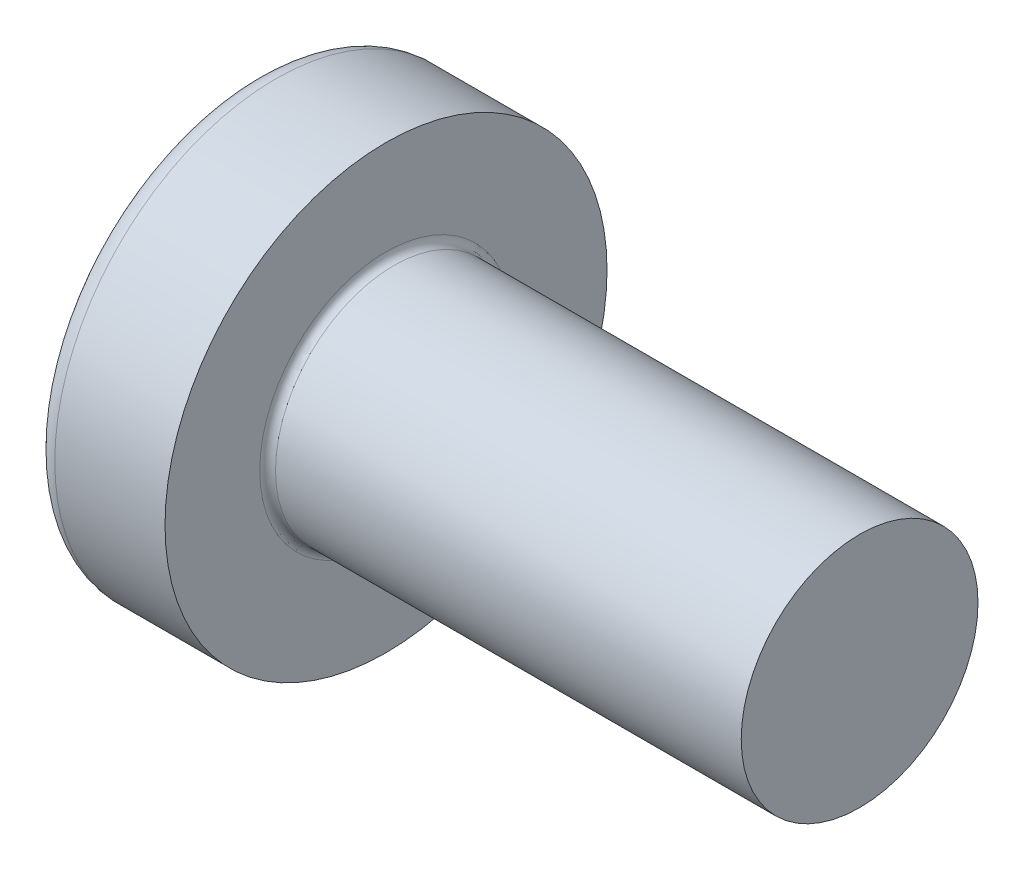
ISO-10303-21;
HEADER;
FILE_DESCRIPTION(('STEP AP214'),'2;1');
FILE_NAME('part.step','',(''),(''),'','','');
FILE_SCHEMA(('AUTOMOTIVE_DESIGN { 1 0 10303 214 1 1 1 1 }'));
ENDSEC;
DATA;
#1=APPLICATION_CONTEXT('core data for automotive mechanical design processes');
#2=APPLICATION_PROTOCOL_DEFINITION('international standard','automotive_design',2000,#1);
#3=PRODUCT_CONTEXT('',#1,'mechanical');
#4=PRODUCT('Part','Part','',(#3));
#5=PRODUCT_RELATED_PRODUCT_CATEGORY('part','',(#4));
#6=PRODUCT_DEFINITION_FORMATION('','',#4);
#7=PRODUCT_DEFINITION_CONTEXT('part definition',#1,'design');
#8=PRODUCT_DEFINITION('design','',#6,#7);
#9=PRODUCT_DEFINITION_SHAPE('','',#8);
#10=(LENGTH_UNIT() NAMED_UNIT(*) SI_UNIT(.MILLI.,.METRE.));
#11=(NAMED_UNIT(*) PLANE_ANGLE_UNIT() SI_UNIT($,.RADIAN.));
#12=(NAMED_UNIT(*) SI_UNIT($,.STERADIAN.) SOLID_ANGLE_UNIT());
#13=UNCERTAINTY_MEASURE_WITH_UNIT(LENGTH_MEASURE(1.E-05),#10,'distance_accuracy_value','');
#14=(GEOMETRIC_REPRESENTATION_CONTEXT(3) GLOBAL_UNCERTAINTY_ASSIGNED_CONTEXT((#13)) GLOBAL_UNIT_ASSIGNED_CONTEXT((#10,
#11,#12)) REPRESENTATION_CONTEXT('',''));
#15=CARTESIAN_POINT('',(0.,0.,0.));
#16=DIRECTION('',(0.,0.,1.));
#17=DIRECTION('',(1.,0.,0.));
#18=AXIS2_PLACEMENT_3D('',#15,#16,#17);
#19=CARTESIAN_POINT('',(5.,0.,0.));
#20=DIRECTION('',(-1.,0.,0.));
#21=DIRECTION('',(0.,1.,0.));
#22=AXIS2_PLACEMENT_3D('',#19,#20,#21);
#23=SPHERICAL_SURFACE('',#22,5.);
#24=CARTESIAN_POINT('',(0.775371598933733,0.,0.));
#25=DIRECTION('',(-1.,0.,0.));
#26=DIRECTION('',(0.,0.,1.));
#27=AXIS2_PLACEMENT_3D('',#24,#25,#26);
#28=CIRCLE('',#27,2.67441860465116);
#29=CARTESIAN_POINT('',(0.775371598933733,0.,2.67441860465116));
#30=VERTEX_POINT('',#29);
#31=EDGE_CURVE('E245',#30,#30,#28,.T.);
#32=ORIENTED_EDGE('',*,*,#31,.T.);
#33=EDGE_LOOP('',(#32));
#34=FACE_BOUND('',#33,.T.);
#35=CARTESIAN_POINT('',(0.0457951200896417,0.,0.));
#36=DIRECTION('',(1.,0.,0.));
#37=DIRECTION('',(0.,0.,-1.));
#38=AXIS2_PLACEMENT_3D('',#35,#36,#37);
#39=CIRCLE('',#38,0.675169614150692);
#40=CARTESIAN_POINT('',(0.0457951200896426,-0.369999999999998,-0.564760133040919));
#41=VERTEX_POINT('',#40);
#42=CARTESIAN_POINT('',(0.0457951200896417,-0.564760133040916,-0.37));
#43=VERTEX_POINT('',#42);
#44=EDGE_CURVE('E381',#41,#43,#39,.F.);
#45=ORIENTED_EDGE('',*,*,#44,.F.);
#46=CARTESIAN_POINT('',(5.,-0.37,0.));
#47=DIRECTION('',(0.,1.,0.));
#48=DIRECTION('',(0.,0.,1.));
#49=AXIS2_PLACEMENT_3D('',#46,#47,#48);
#50=CIRCLE('',#49,4.98629120689917);
#51=CARTESIAN_POINT('',(0.187869734228637,-0.369999999999995,-1.30633162146801));
#52=VERTEX_POINT('',#51);
#53=EDGE_CURVE('E307',#52,#41,#50,.T.);
#54=ORIENTED_EDGE('',*,*,#53,.F.);
#55=CARTESIAN_POINT('',(4.56358262530788,0.,0.875317983306049));
#56=DIRECTION('',(0.446197753347464,0.,-0.894934391398429));
#57=DIRECTION('',(-0.894934391398429,0.,-0.446197753347464));
#58=AXIS2_PLACEMENT_3D('',#55,#56,#57);
#59=CIRCLE('',#58,4.90340272700172);
#60=CARTESIAN_POINT('',(0.187869734228637,0.370000000000005,-1.30633162146801));
#61=VERTEX_POINT('',#60);
#62=EDGE_CURVE('E279',#52,#61,#59,.T.);
#63=ORIENTED_EDGE('',*,*,#62,.T.);
#64=CARTESIAN_POINT('',(5.,0.37,0.));
#65=DIRECTION('',(0.,-1.,0.));
#66=DIRECTION('',(0.,0.,-1.));
#67=AXIS2_PLACEMENT_3D('',#64,#65,#66);
#68=CIRCLE('',#67,4.98629120689917);
#69=CARTESIAN_POINT('',(0.0457951200896421,0.370000000000002,-0.564760133040916));
#70=VERTEX_POINT('',#69);
#71=EDGE_CURVE('E334',#70,#61,#68,.T.);
#72=ORIENTED_EDGE('',*,*,#71,.F.);
#73=CARTESIAN_POINT('',(0.0457951200896417,0.564760133040915,-0.37));
#74=VERTEX_POINT('',#73);
#75=EDGE_CURVE('E400',#74,#70,#39,.F.);
#76=ORIENTED_EDGE('',*,*,#75,.F.);
#77=CARTESIAN_POINT('',(5.,0.,-0.37));
#78=DIRECTION('',(0.,0.,1.));
#79=DIRECTION('',(1.,0.,0.));
#80=AXIS2_PLACEMENT_3D('',#77,#78,#79);
#81=CIRCLE('',#80,4.98629120689917);
#82=CARTESIAN_POINT('',(0.187869734228643,1.30633162146802,-0.37));
#83=VERTEX_POINT('',#82);
#84=EDGE_CURVE('E273',#83,#74,#81,.T.);
#85=ORIENTED_EDGE('',*,*,#84,.F.);
#86=CARTESIAN_POINT('',(4.56358262530808,-0.87531798330579,0.));
#87=DIRECTION('',(0.446197753347408,0.894934391398457,0.));
#88=DIRECTION('',(-0.894934391398457,0.446197753347408,0.));
#89=AXIS2_PLACEMENT_3D('',#86,#87,#88);
#90=CIRCLE('',#89,4.90340272700178);
#91=CARTESIAN_POINT('',(0.187869734228643,1.30633162146802,0.37));
#92=VERTEX_POINT('',#91);
#93=EDGE_CURVE('E276',#83,#92,#90,.T.);
#94=ORIENTED_EDGE('',*,*,#93,.T.);
#95=CARTESIAN_POINT('',(5.,0.,0.37));
#96=DIRECTION('',(0.,0.,-1.));
#97=DIRECTION('',(0.,1.,0.));
#98=AXIS2_PLACEMENT_3D('',#95,#96,#97);
#99=CIRCLE('',#98,4.98629120689917);
#100=CARTESIAN_POINT('',(0.0457951200896417,0.564760133040915,0.37));
#101=VERTEX_POINT('',#100);
#102=EDGE_CURVE('E269',#101,#92,#99,.T.);
#103=ORIENTED_EDGE('',*,*,#102,.F.);
#104=CARTESIAN_POINT('',(0.0457951200896426,0.369999999999998,0.564760133040918));
#105=VERTEX_POINT('',#104);
#106=EDGE_CURVE('E399',#105,#101,#39,.F.);
#107=ORIENTED_EDGE('',*,*,#106,.F.);
#108=CARTESIAN_POINT('',(0.187869734228643,0.369999999999995,1.30633162146802));
#109=VERTEX_POINT('',#108);
#110=EDGE_CURVE('E289',#109,#105,#68,.T.);
#111=ORIENTED_EDGE('',*,*,#110,.F.);
#112=CARTESIAN_POINT('',(4.56358262530808,0.,-0.87531798330579));
#113=DIRECTION('',(0.446197753347408,0.,0.894934391398457));
#114=DIRECTION('',(0.894934391398457,0.,-0.446197753347408));
#115=AXIS2_PLACEMENT_3D('',#112,#113,#114);
#116=CIRCLE('',#115,4.90340272700178);
#117=CARTESIAN_POINT('',(0.187869734228642,-0.370000000000004,1.30633162146802));
#118=VERTEX_POINT('',#117);
#119=EDGE_CURVE('E55',#109,#118,#116,.T.);
#120=ORIENTED_EDGE('',*,*,#119,.T.);
#121=CARTESIAN_POINT('',(0.0457951200896416,-0.370000000000002,0.564760133040916));
#122=VERTEX_POINT('',#121);
#123=EDGE_CURVE('E286',#122,#118,#50,.T.);
#124=ORIENTED_EDGE('',*,*,#123,.F.);
#125=CARTESIAN_POINT('',(0.0457951200896417,-0.564760133040916,0.37));
#126=VERTEX_POINT('',#125);
#127=EDGE_CURVE('E439',#126,#122,#39,.F.);
#128=ORIENTED_EDGE('',*,*,#127,.F.);
#129=CARTESIAN_POINT('',(0.187869734228637,-1.30633162146801,0.37));
#130=VERTEX_POINT('',#129);
#131=EDGE_CURVE('E270',#130,#126,#99,.T.);
#132=ORIENTED_EDGE('',*,*,#131,.F.);
#133=CARTESIAN_POINT('',(4.56358262530788,0.875317983306049,0.));
#134=DIRECTION('',(0.446197753347464,-0.894934391398429,0.));
#135=DIRECTION('',(0.894934391398429,0.446197753347464,0.));
#136=AXIS2_PLACEMENT_3D('',#133,#134,#135);
#137=CIRCLE('',#136,4.90340272700172);
#138=CARTESIAN_POINT('',(0.187869734228637,-1.30633162146801,-0.37));
#139=VERTEX_POINT('',#138);
#140=EDGE_CURVE('E266',#130,#139,#137,.T.);
#141=ORIENTED_EDGE('',*,*,#140,.T.);
#142=EDGE_CURVE('E70',#43,#139,#81,.T.);
#143=ORIENTED_EDGE('',*,*,#142,.F.);
#144=EDGE_LOOP('',(#45,#54,#63,#72,#76,#85,#94,#103,#107,#111,#120,#124,#128,#132,#141,#143));
#145=FACE_BOUND('',#144,.T.);
#146=ADVANCED_FACE('F41',(#34,#145),#23,.T.);
#147=CARTESIAN_POINT('',(1.75,0.527482331819,-0.37));
#148=DIRECTION('',(0.,0.,1.));
#149=DIRECTION('',(1.,0.,0.));
#150=AXIS2_PLACEMENT_3D('',#147,#148,#149);
#151=PLANE('',#150);
#152=ORIENTED_EDGE('',*,*,#84,.T.);
#153=CARTESIAN_POINT('',(-0.987293237053716,0.649401255967161,-0.37));
#154=CARTESIAN_POINT('',(-0.781914975317084,0.632865887002871,-0.37));
#155=CARTESIAN_POINT('',(-0.576547882393372,0.616188977635081,-0.37));
#156=CARTESIAN_POINT('',(-0.165841599226327,0.582441031964227,-0.37));
#157=CARTESIAN_POINT('',(0.0394975903090453,0.56536998705488,-0.37));
#158=CARTESIAN_POINT('',(0.450133475422572,0.530723441326535,-0.37));
#159=CARTESIAN_POINT('',(0.655430171010574,0.513147940624557,-0.37));
#160=CARTESIAN_POINT('',(1.06596140177934,0.477314957985794,-0.37));
#161=CARTESIAN_POINT('',(1.2711959378071,0.459057485806066,-0.37));
#162=CARTESIAN_POINT('',(1.61065292365626,0.428051938688768,-0.37));
#163=CARTESIAN_POINT('',(1.74490059995642,0.415580824990931,-0.37));
#164=CARTESIAN_POINT('',(2.01334321762763,0.39009202340498,-0.37));
#165=CARTESIAN_POINT('',(2.14753815934577,0.377074339177353,-0.37));
#166=CARTESIAN_POINT('',(2.41586354151957,0.350315629452842,-0.37));
#167=CARTESIAN_POINT('',(2.5499939784531,0.33657456817765,-0.37));
#168=CARTESIAN_POINT('',(2.81814173295471,0.308004077741875,-0.37));
#169=CARTESIAN_POINT('',(2.95215904765134,0.293174621747065,-0.37));
#170=CARTESIAN_POINT('',(3.0860955068368,0.277618485071816,-0.37));
#171=B_SPLINE_CURVE_WITH_KNOTS('',3,(#153,#154,#155,#156,#157,#158,#159,#160,#161,#162,#163,
#164,#165,#166,#167,#168,#169,#170),.UNSPECIFIED.,.F.,.F.,(4,2,2,2,2,2,2,2,4),(0.,
0.618128793984691,1.23627109812525,1.85441325887562,2.4725465791681,2.87702276218609,
3.28149623678161,3.68598973550942,4.09049321032311),.UNSPECIFIED.);
#172=CARTESIAN_POINT('',(1.75,0.415013252800437,-0.37));
#173=VERTEX_POINT('',#172);
#174=EDGE_CURVE('E423',#74,#173,#171,.T.);
#175=ORIENTED_EDGE('',*,*,#174,.T.);
#176=DIRECTION('',(0.,1.,0.));
#177=VECTOR('',#176,1.);
#178=CARTESIAN_POINT('',(1.75,-0.527482331818862,-0.37));
#179=LINE('',#178,#177);
#180=CARTESIAN_POINT('',(1.75,0.527482331819,-0.37));
#181=VERTEX_POINT('',#180);
#182=EDGE_CURVE('E363',#173,#181,#179,.T.);
#183=ORIENTED_EDGE('',*,*,#182,.T.);
#184=DIRECTION('',(0.894934391398457,-0.446197753347408,0.));
#185=VECTOR('',#184,1.);
#186=CARTESIAN_POINT('',(0.,1.4,-0.37));
#187=LINE('',#186,#185);
#188=EDGE_CURVE('E246',#83,#181,#187,.T.);
#189=ORIENTED_EDGE('',*,*,#188,.F.);
#190=EDGE_LOOP('',(#152,#175,#183,#189));
#191=FACE_BOUND('',#190,.T.);
#192=ADVANCED_FACE('F200',(#191),#151,.T.);
#193=CARTESIAN_POINT('',(1.75,-0.527482331818862,-0.37));
#194=VERTEX_POINT('',#193);
#195=CARTESIAN_POINT('',(1.75,-0.415013252800437,-0.37));
#196=VERTEX_POINT('',#195);
#197=EDGE_CURVE('E254',#194,#196,#179,.T.);
#198=ORIENTED_EDGE('',*,*,#197,.T.);
#199=CARTESIAN_POINT('',(-0.987293237053716,-0.649401255967161,-0.37));
#200=CARTESIAN_POINT('',(-0.781914975317084,-0.632865887002871,-0.37));
#201=CARTESIAN_POINT('',(-0.576547882393373,-0.616188977635081,-0.37));
#202=CARTESIAN_POINT('',(-0.165841599226327,-0.582441031964227,-0.37));
#203=CARTESIAN_POINT('',(0.0394975903090452,-0.565369987054879,-0.37));
#204=CARTESIAN_POINT('',(0.450133475422572,-0.530723441326535,-0.37));
#205=CARTESIAN_POINT('',(0.655430171010574,-0.513147940624557,-0.37));
#206=CARTESIAN_POINT('',(1.06596140177934,-0.477314957985794,-0.37));
#207=CARTESIAN_POINT('',(1.2711959378071,-0.459057485806066,-0.37));
#208=CARTESIAN_POINT('',(1.61065292365626,-0.428051938688768,-0.37));
#209=CARTESIAN_POINT('',(1.74490059995643,-0.415580824990931,-0.37));
#210=CARTESIAN_POINT('',(2.01334321762763,-0.390092023404979,-0.37));
#211=CARTESIAN_POINT('',(2.14753815934577,-0.377074339177353,-0.37));
#212=CARTESIAN_POINT('',(2.41586354151957,-0.350315629452842,-0.37));
#213=CARTESIAN_POINT('',(2.5499939784531,-0.33657456817765,-0.37));
#214=CARTESIAN_POINT('',(2.81814173295471,-0.308004077741875,-0.37));
#215=CARTESIAN_POINT('',(2.95215904765134,-0.293174621747065,-0.37));
#216=CARTESIAN_POINT('',(3.0860955068368,-0.277618485071816,-0.37));
#217=B_SPLINE_CURVE_WITH_KNOTS('',3,(#199,#200,#201,#202,#203,#204,#205,#206,#207,#208,#209,
#210,#211,#212,#213,#214,#215,#216),.UNSPECIFIED.,.F.,.F.,(4,2,2,2,2,2,2,2,4),(0.,
0.618128793984691,1.23627109812525,1.85441325887562,2.4725465791681,2.87702276218609,
3.28149623678161,3.68598973550942,4.09049321032311),.UNSPECIFIED.);
#218=EDGE_CURVE('E398',#196,#43,#217,.F.);
#219=ORIENTED_EDGE('',*,*,#218,.T.);
#220=ORIENTED_EDGE('',*,*,#142,.T.);
#221=DIRECTION('',(0.894934391398429,0.446197753347464,0.));
#222=VECTOR('',#221,1.);
#223=CARTESIAN_POINT('',(0.,-1.4,-0.37));
#224=LINE('',#223,#222);
#225=EDGE_CURVE('E337',#139,#194,#224,.T.);
#226=ORIENTED_EDGE('',*,*,#225,.T.);
#227=EDGE_LOOP('',(#198,#219,#220,#226));
#228=FACE_BOUND('',#227,.T.);
#229=ADVANCED_FACE('F207',(#228),#151,.T.);
#230=CARTESIAN_POINT('',(1.75,-0.527482331818863,0.37));
#231=DIRECTION('',(0.,0.,-1.));
#232=DIRECTION('',(0.,1.,0.));
#233=AXIS2_PLACEMENT_3D('',#230,#231,#232);
#234=PLANE('',#233);
#235=DIRECTION('',(0.,-1.,0.));
#236=VECTOR('',#235,1.);
#237=CARTESIAN_POINT('',(1.75,0.527482331819,0.37));
#238=LINE('',#237,#236);
#239=CARTESIAN_POINT('',(1.75,0.527482331819,0.37));
#240=VERTEX_POINT('',#239);
#241=CARTESIAN_POINT('',(1.75,0.415013252800437,0.37));
#242=VERTEX_POINT('',#241);
#243=EDGE_CURVE('E346',#240,#242,#238,.T.);
#244=ORIENTED_EDGE('',*,*,#243,.T.);
#245=CARTESIAN_POINT('',(-0.987293237069635,0.649401255968442,0.37));
#246=CARTESIAN_POINT('',(-0.781914975331301,0.632865887004023,0.37));
#247=CARTESIAN_POINT('',(-0.576547882405888,0.616188977636103,0.37));
#248=CARTESIAN_POINT('',(-0.165841599235439,0.582441031964983,0.37));
#249=CARTESIAN_POINT('',(0.039497590301634,0.5653699870555,0.37));
#250=CARTESIAN_POINT('',(0.450133475420602,0.530723441326706,0.37));
#251=CARTESIAN_POINT('',(0.655430171012341,0.513147940624409,0.37));
#252=CARTESIAN_POINT('',(1.06596140178858,0.477314957984981,0.37));
#253=CARTESIAN_POINT('',(1.27119593782008,0.459057485804908,0.37));
#254=CARTESIAN_POINT('',(1.61065292367297,0.428051938687225,0.37));
#255=CARTESIAN_POINT('',(1.74490059997313,0.415580824989367,0.37));
#256=CARTESIAN_POINT('',(2.01334321764434,0.390092023403371,0.37));
#257=CARTESIAN_POINT('',(2.14753815936247,0.377074339175718,0.37));
#258=CARTESIAN_POINT('',(2.41586354153627,0.350315629451146,0.37));
#259=CARTESIAN_POINT('',(2.54999397846979,0.336574568175918,0.37));
#260=CARTESIAN_POINT('',(2.8181417329714,0.308004077740054,0.37));
#261=CARTESIAN_POINT('',(2.95215904766802,0.293174621745189,0.37));
#262=CARTESIAN_POINT('',(3.08609550685347,0.277618485069873,0.37));
#263=B_SPLINE_CURVE_WITH_KNOTS('',3,(#245,#246,#247,#248,#249,#250,#251,#252,#253,#254,#255,
#256,#257,#258,#259,#260,#261,#262),.UNSPECIFIED.,.F.,.F.,(4,2,2,2,2,2,2,2,4),(0.,
0.618128793989811,1.23627109813549,1.85441325889711,2.47254657920086,2.87702276221884,
3.28149623681436,3.68598973554217,4.09049321035586),.UNSPECIFIED.);
#264=EDGE_CURVE('E644',#242,#101,#263,.F.);
#265=ORIENTED_EDGE('',*,*,#264,.T.);
#266=ORIENTED_EDGE('',*,*,#102,.T.);
#267=DIRECTION('',(0.894934391398457,-0.446197753347408,0.));
#268=VECTOR('',#267,1.);
#269=CARTESIAN_POINT('',(0.,1.4,0.37));
#270=LINE('',#269,#268);
#271=EDGE_CURVE('E251',#92,#240,#270,.T.);
#272=ORIENTED_EDGE('',*,*,#271,.T.);
#273=EDGE_LOOP('',(#244,#265,#266,#272));
#274=FACE_BOUND('',#273,.T.);
#275=ADVANCED_FACE('F419',(#274),#234,.T.);
#276=ORIENTED_EDGE('',*,*,#131,.T.);
#277=CARTESIAN_POINT('',(-0.987293237069635,-0.649401255968442,0.37));
#278=CARTESIAN_POINT('',(-0.781914975331301,-0.632865887004024,0.37));
#279=CARTESIAN_POINT('',(-0.576547882405888,-0.616188977636103,0.37));
#280=CARTESIAN_POINT('',(-0.16584159923544,-0.582441031964983,0.37));
#281=CARTESIAN_POINT('',(0.0394975903016337,-0.5653699870555,0.37));
#282=CARTESIAN_POINT('',(0.450133475420601,-0.530723441326706,0.37));
#283=CARTESIAN_POINT('',(0.655430171012341,-0.513147940624409,0.37));
#284=CARTESIAN_POINT('',(1.06596140178858,-0.477314957984981,0.37));
#285=CARTESIAN_POINT('',(1.27119593782008,-0.459057485804908,0.37));
#286=CARTESIAN_POINT('',(1.61065292367297,-0.428051938687225,0.37));
#287=CARTESIAN_POINT('',(1.74490059997313,-0.415580824989368,0.37));
#288=CARTESIAN_POINT('',(2.01334321764434,-0.390092023403371,0.37));
#289=CARTESIAN_POINT('',(2.14753815936247,-0.377074339175718,0.37));
#290=CARTESIAN_POINT('',(2.41586354153627,-0.350315629451146,0.37));
#291=CARTESIAN_POINT('',(2.54999397846979,-0.336574568175918,0.37));
#292=CARTESIAN_POINT('',(2.8181417329714,-0.308004077740054,0.37));
#293=CARTESIAN_POINT('',(2.95215904766802,-0.29317462174519,0.37));
#294=CARTESIAN_POINT('',(3.08609550685347,-0.277618485069873,0.37));
#295=B_SPLINE_CURVE_WITH_KNOTS('',3,(#277,#278,#279,#280,#281,#282,#283,#284,#285,#286,#287,
#288,#289,#290,#291,#292,#293,#294),.UNSPECIFIED.,.F.,.F.,(4,2,2,2,2,2,2,2,4),(0.,
0.61812879398981,1.23627109813549,1.85441325889711,2.47254657920086,2.87702276221884,
3.28149623681436,3.68598973554218,4.09049321035586),.UNSPECIFIED.);
#296=CARTESIAN_POINT('',(1.75,-0.415013252800437,0.37));
#297=VERTEX_POINT('',#296);
#298=EDGE_CURVE('E440',#126,#297,#295,.T.);
#299=ORIENTED_EDGE('',*,*,#298,.T.);
#300=CARTESIAN_POINT('',(1.75,-0.527482331818863,0.37));
#301=VERTEX_POINT('',#300);
#302=EDGE_CURVE('E348',#297,#301,#238,.T.);
#303=ORIENTED_EDGE('',*,*,#302,.T.);
#304=DIRECTION('',(0.894934391398429,0.446197753347464,0.));
#305=VECTOR('',#304,1.);
#306=CARTESIAN_POINT('',(0.,-1.4,0.37));
#307=LINE('',#306,#305);
#308=EDGE_CURVE('E339',#130,#301,#307,.T.);
#309=ORIENTED_EDGE('',*,*,#308,.F.);
#310=EDGE_LOOP('',(#276,#299,#303,#309));
#311=FACE_BOUND('',#310,.T.);
#312=ADVANCED_FACE('F535',(#311),#234,.T.);
#313=CARTESIAN_POINT('',(1.75,0.527482331819,0.37));
#314=DIRECTION('',(0.446197753347408,0.894934391398457,0.));
#315=DIRECTION('',(-0.894934391398457,0.446197753347408,0.));
#316=AXIS2_PLACEMENT_3D('',#313,#314,#315);
#317=PLANE('',#316);
#318=CARTESIAN_POINT('',(2.6696526882834,0.0689604923233289,0.));
#319=DIRECTION('',(0.446197753347408,0.894934391398457,0.));
#320=DIRECTION('',(-0.894934391398457,0.446197753347408,0.));
#321=AXIS2_PLACEMENT_3D('',#318,#319,#320);
#322=ELLIPSE('',#321,1.10195897609157,0.486831694838751);
#323=CARTESIAN_POINT('',(1.75,0.527482331819001,0.175779377683475));
#324=VERTEX_POINT('',#323);
#325=CARTESIAN_POINT('',(1.75,0.527482331819001,-0.175779377683475));
#326=VERTEX_POINT('',#325);
#327=EDGE_CURVE('E312',#324,#326,#322,.F.);
#328=ORIENTED_EDGE('',*,*,#327,.F.);
#329=DIRECTION('',(0.,0.,-1.));
#330=VECTOR('',#329,1.);
#331=CARTESIAN_POINT('',(1.75,0.527482331819,0.37));
#332=LINE('',#331,#330);
#333=EDGE_CURVE('E349',#240,#324,#332,.T.);
#334=ORIENTED_EDGE('',*,*,#333,.F.);
#335=ORIENTED_EDGE('',*,*,#271,.F.);
#336=ORIENTED_EDGE('',*,*,#93,.F.);
#337=ORIENTED_EDGE('',*,*,#188,.T.);
#338=EDGE_CURVE('E351',#326,#181,#332,.T.);
#339=ORIENTED_EDGE('',*,*,#338,.F.);
#340=EDGE_LOOP('',(#328,#334,#335,#336,#337,#339));
#341=FACE_BOUND('',#340,.T.);
#342=ADVANCED_FACE('F417',(#341),#317,.F.);
#343=CARTESIAN_POINT('',(0.,-1.4,-0.37));
#344=DIRECTION('',(0.446197753347464,-0.894934391398429,0.));
#345=DIRECTION('',(0.894934391398429,0.446197753347464,0.));
#346=AXIS2_PLACEMENT_3D('',#343,#344,#345);
#347=PLANE('',#346);
#348=CARTESIAN_POINT('',(2.669652688283,-0.068960492323322,0.));
#349=DIRECTION('',(0.446197753347464,-0.894934391398429,0.));
#350=DIRECTION('',(-0.894934391398429,-0.446197753347464,0.));
#351=AXIS2_PLACEMENT_3D('',#348,#349,#350);
#352=ELLIPSE('',#351,1.1019589760915,0.486831694838781);
#353=CARTESIAN_POINT('',(1.75,-0.527482331818863,-0.175779377683887));
#354=VERTEX_POINT('',#353);
#355=CARTESIAN_POINT('',(1.75,-0.527482331818863,0.175779377683887));
#356=VERTEX_POINT('',#355);
#357=EDGE_CURVE('E646',#354,#356,#352,.F.);
#358=ORIENTED_EDGE('',*,*,#357,.F.);
#359=DIRECTION('',(0.,0.,1.));
#360=VECTOR('',#359,1.);
#361=CARTESIAN_POINT('',(1.75,-0.527482331818862,-0.37));
#362=LINE('',#361,#360);
#363=EDGE_CURVE('E342',#194,#354,#362,.T.);
#364=ORIENTED_EDGE('',*,*,#363,.F.);
#365=ORIENTED_EDGE('',*,*,#225,.F.);
#366=ORIENTED_EDGE('',*,*,#140,.F.);
#367=ORIENTED_EDGE('',*,*,#308,.T.);
#368=EDGE_CURVE('E345',#356,#301,#362,.T.);
#369=ORIENTED_EDGE('',*,*,#368,.F.);
#370=EDGE_LOOP('',(#358,#364,#365,#366,#367,#369));
#371=FACE_BOUND('',#370,.T.);
#372=ADVANCED_FACE('F522',(#371),#347,.F.);
#373=CARTESIAN_POINT('',(1.75,0.527482331819,-0.37));
#374=DIRECTION('',(-1.,0.,0.));
#375=DIRECTION('',(0.,0.,1.));
#376=AXIS2_PLACEMENT_3D('',#373,#374,#375);
#377=PLANE('',#376);
#378=DIRECTION('',(0.,1.,0.));
#379=VECTOR('',#378,1.);
#380=CARTESIAN_POINT('',(1.75,-0.370000000000002,0.527482331818999));
#381=LINE('',#380,#379);
#382=CARTESIAN_POINT('',(1.75,-0.370000000000002,0.527482331818999));
#383=VERTEX_POINT('',#382);
#384=CARTESIAN_POINT('',(1.75,-0.175779377683479,0.527482331818999));
#385=VERTEX_POINT('',#384);
#386=EDGE_CURVE('E327',#383,#385,#381,.T.);
#387=ORIENTED_EDGE('',*,*,#386,.T.);
#388=CARTESIAN_POINT('',(1.75,0.,0.));
#389=DIRECTION('',(-1.,0.,0.));
#390=DIRECTION('',(0.,0.,1.));
#391=AXIS2_PLACEMENT_3D('',#388,#389,#390);
#392=CIRCLE('',#391,0.556);
#393=CARTESIAN_POINT('',(1.75,-0.370000000000001,0.415013252800437));
#394=VERTEX_POINT('',#393);
#395=EDGE_CURVE('E675',#394,#385,#392,.T.);
#396=ORIENTED_EDGE('',*,*,#395,.F.);
#397=DIRECTION('',(0.,0.,-1.));
#398=VECTOR('',#397,1.);
#399=CARTESIAN_POINT('',(1.75,-0.370000000000002,0.527482331818999));
#400=LINE('',#399,#398);
#401=EDGE_CURVE('E323',#383,#394,#400,.T.);
#402=ORIENTED_EDGE('',*,*,#401,.F.);
#403=EDGE_LOOP('',(#387,#396,#402));
#404=FACE_BOUND('',#403,.T.);
#405=ADVANCED_FACE('F513',(#404),#377,.T.);
#406=ORIENTED_EDGE('',*,*,#302,.F.);
#407=EDGE_CURVE('E680',#356,#297,#392,.T.);
#408=ORIENTED_EDGE('',*,*,#407,.F.);
#409=ORIENTED_EDGE('',*,*,#368,.T.);
#410=EDGE_LOOP('',(#406,#408,#409));
#411=FACE_BOUND('',#410,.T.);
#412=ADVANCED_FACE('F505',(#411),#377,.T.);
#413=ORIENTED_EDGE('',*,*,#363,.T.);
#414=EDGE_CURVE('E392',#196,#354,#392,.T.);
#415=ORIENTED_EDGE('',*,*,#414,.F.);
#416=ORIENTED_EDGE('',*,*,#197,.F.);
#417=EDGE_LOOP('',(#413,#415,#416));
#418=FACE_BOUND('',#417,.T.);
#419=ADVANCED_FACE('F497',(#418),#377,.T.);
#420=CARTESIAN_POINT('',(1.75,-0.369999999999998,-0.415013252800438));
#421=VERTEX_POINT('',#420);
#422=CARTESIAN_POINT('',(1.75,-0.369999999999998,-0.527482331818864));
#423=VERTEX_POINT('',#422);
#424=EDGE_CURVE('E326',#421,#423,#400,.T.);
#425=ORIENTED_EDGE('',*,*,#424,.F.);
#426=CARTESIAN_POINT('',(1.75,-0.175779377683887,-0.527482331818863));
#427=VERTEX_POINT('',#426);
#428=EDGE_CURVE('E62',#427,#421,#392,.T.);
#429=ORIENTED_EDGE('',*,*,#428,.F.);
#430=DIRECTION('',(0.,-1.,0.));
#431=VECTOR('',#430,1.);
#432=CARTESIAN_POINT('',(1.75,0.370000000000002,-0.527482331818861));
#433=LINE('',#432,#431);
#434=EDGE_CURVE('E322',#427,#423,#433,.T.);
#435=ORIENTED_EDGE('',*,*,#434,.T.);
#436=EDGE_LOOP('',(#425,#429,#435));
#437=FACE_BOUND('',#436,.T.);
#438=ADVANCED_FACE('F387',(#437),#377,.T.);
#439=CARTESIAN_POINT('',(1.75,0.370000000000002,-0.527482331818861));
#440=VERTEX_POINT('',#439);
#441=CARTESIAN_POINT('',(1.75,0.175779377683891,-0.527482331818862));
#442=VERTEX_POINT('',#441);
#443=EDGE_CURVE('E319',#440,#442,#433,.T.);
#444=ORIENTED_EDGE('',*,*,#443,.T.);
#445=CARTESIAN_POINT('',(1.75,0.370000000000001,-0.415013252800436));
#446=VERTEX_POINT('',#445);
#447=EDGE_CURVE('E391',#446,#442,#392,.T.);
#448=ORIENTED_EDGE('',*,*,#447,.F.);
#449=DIRECTION('',(0.,0.,1.));
#450=VECTOR('',#449,1.);
#451=CARTESIAN_POINT('',(1.75,0.370000000000002,-0.527482331818861));
#452=LINE('',#451,#450);
#453=EDGE_CURVE('E331',#440,#446,#452,.T.);
#454=ORIENTED_EDGE('',*,*,#453,.F.);
#455=EDGE_LOOP('',(#444,#448,#454));
#456=FACE_BOUND('',#455,.T.);
#457=ADVANCED_FACE('F482',(#456),#377,.T.);
#458=ORIENTED_EDGE('',*,*,#182,.F.);
#459=EDGE_CURVE('E663',#326,#173,#392,.T.);
#460=ORIENTED_EDGE('',*,*,#459,.F.);
#461=ORIENTED_EDGE('',*,*,#338,.T.);
#462=EDGE_LOOP('',(#458,#460,#461));
#463=FACE_BOUND('',#462,.T.);
#464=ADVANCED_FACE('F474',(#463),#377,.T.);
#465=ORIENTED_EDGE('',*,*,#333,.T.);
#466=EDGE_CURVE('E665',#242,#324,#392,.T.);
#467=ORIENTED_EDGE('',*,*,#466,.F.);
#468=ORIENTED_EDGE('',*,*,#243,.F.);
#469=EDGE_LOOP('',(#465,#467,#468));
#470=FACE_BOUND('',#469,.T.);
#471=ADVANCED_FACE('F468',(#470),#377,.T.);
#472=CARTESIAN_POINT('',(1.75,0.369999999999998,0.527482331819001));
#473=DIRECTION('',(0.,-1.,0.));
#474=DIRECTION('',(1.,0.,0.));
#475=AXIS2_PLACEMENT_3D('',#472,#473,#474);
#476=PLANE('',#475);
#477=ORIENTED_EDGE('',*,*,#110,.T.);
#478=CARTESIAN_POINT('',(-0.987293237069635,0.369999999999998,0.649401255968443));
#479=CARTESIAN_POINT('',(-0.781914975331301,0.369999999999998,0.632865887004025));
#480=CARTESIAN_POINT('',(-0.576547882405888,0.369999999999998,0.616188977636104));
#481=CARTESIAN_POINT('',(-0.16584159923544,0.369999999999998,0.582441031964984));
#482=CARTESIAN_POINT('',(0.039497590301634,0.369999999999998,0.565369987055501));
#483=CARTESIAN_POINT('',(0.450133475420602,0.369999999999998,0.530723441326707));
#484=CARTESIAN_POINT('',(0.655430171012341,0.369999999999998,0.51314794062441));
#485=CARTESIAN_POINT('',(1.06596140178858,0.369999999999998,0.477314957984982));
#486=CARTESIAN_POINT('',(1.27119593782008,0.369999999999998,0.459057485804909));
#487=CARTESIAN_POINT('',(1.61065292367297,0.369999999999999,0.428051938687226));
#488=CARTESIAN_POINT('',(1.74490059997313,0.369999999999999,0.415580824989369));
#489=CARTESIAN_POINT('',(2.01334321764434,0.369999999999999,0.390092023403372));
#490=CARTESIAN_POINT('',(2.14753815936247,0.369999999999999,0.37707433917572));
#491=CARTESIAN_POINT('',(2.41586354153627,0.369999999999999,0.350315629451147));
#492=CARTESIAN_POINT('',(2.54999397846979,0.369999999999999,0.336574568175919));
#493=CARTESIAN_POINT('',(2.8181417329714,0.369999999999999,0.308004077740055));
#494=CARTESIAN_POINT('',(2.95215904766802,0.369999999999999,0.293174621745191));
#495=CARTESIAN_POINT('',(3.08609550685347,0.369999999999999,0.277618485069874));
#496=B_SPLINE_CURVE_WITH_KNOTS('',3,(#478,#479,#480,#481,#482,#483,#484,#485,#486,#487,#488,
#489,#490,#491,#492,#493,#494,#495),.UNSPECIFIED.,.F.,.F.,(4,2,2,2,2,2,2,2,4),(0.,
0.61812879398981,1.23627109813549,1.85441325889711,2.47254657920086,2.87702276221884,
3.28149623681436,3.68598973554218,4.09049321035586),.UNSPECIFIED.);
#497=CARTESIAN_POINT('',(1.75,0.369999999999999,0.415013252800439));
#498=VERTEX_POINT('',#497);
#499=EDGE_CURVE('E643',#105,#498,#496,.T.);
#500=ORIENTED_EDGE('',*,*,#499,.T.);
#501=CARTESIAN_POINT('',(1.75,0.369999999999998,0.527482331819001));
#502=VERTEX_POINT('',#501);
#503=EDGE_CURVE('E304',#498,#502,#452,.T.);
#504=ORIENTED_EDGE('',*,*,#503,.T.);
#505=DIRECTION('',(0.894934391398457,0.,-0.446197753347408));
#506=VECTOR('',#505,1.);
#507=CARTESIAN_POINT('',(0.,0.369999999999995,1.4));
#508=LINE('',#507,#506);
#509=EDGE_CURVE('E297',#109,#502,#508,.T.);
#510=ORIENTED_EDGE('',*,*,#509,.F.);
#511=EDGE_LOOP('',(#477,#500,#504,#510));
#512=FACE_BOUND('',#511,.T.);
#513=ADVANCED_FACE('F301',(#512),#476,.T.);
#514=CARTESIAN_POINT('',(1.75,-0.369999999999998,-0.527482331818864));
#515=DIRECTION('',(0.,1.,0.));
#516=DIRECTION('',(0.,0.,1.));
#517=AXIS2_PLACEMENT_3D('',#514,#515,#516);
#518=PLANE('',#517);
#519=ORIENTED_EDGE('',*,*,#401,.T.);
#520=CARTESIAN_POINT('',(-0.987293237053716,-0.370000000000002,0.64940125596716));
#521=CARTESIAN_POINT('',(-0.781914975317085,-0.370000000000002,0.63286588700287));
#522=CARTESIAN_POINT('',(-0.576547882393373,-0.370000000000002,0.61618897763508));
#523=CARTESIAN_POINT('',(-0.165841599226327,-0.370000000000002,0.582441031964226));
#524=CARTESIAN_POINT('',(0.0394975903090451,-0.370000000000002,0.565369987054878));
#525=CARTESIAN_POINT('',(0.450133475422572,-0.370000000000002,0.530723441326534));
#526=CARTESIAN_POINT('',(0.655430171010573,-0.370000000000002,0.513147940624556));
#527=CARTESIAN_POINT('',(1.06596140177934,-0.370000000000002,0.477314957985793));
#528=CARTESIAN_POINT('',(1.2711959378071,-0.370000000000001,0.459057485806065));
#529=CARTESIAN_POINT('',(1.61065292365626,-0.370000000000001,0.428051938688767));
#530=CARTESIAN_POINT('',(1.74490059995643,-0.370000000000001,0.41558082499093));
#531=CARTESIAN_POINT('',(2.01334321762763,-0.370000000000001,0.390092023404978));
#532=CARTESIAN_POINT('',(2.14753815934577,-0.370000000000001,0.377074339177352));
#533=CARTESIAN_POINT('',(2.41586354151957,-0.370000000000001,0.350315629452841));
#534=CARTESIAN_POINT('',(2.5499939784531,-0.370000000000001,0.336574568177649));
#535=CARTESIAN_POINT('',(2.81814173295471,-0.370000000000001,0.308004077741874));
#536=CARTESIAN_POINT('',(2.95215904765134,-0.370000000000001,0.293174621747064));
#537=CARTESIAN_POINT('',(3.0860955068368,-0.370000000000001,0.277618485071814));
#538=B_SPLINE_CURVE_WITH_KNOTS('',3,(#520,#521,#522,#523,#524,#525,#526,#527,#528,#529,#530,
#531,#532,#533,#534,#535,#536,#537),.UNSPECIFIED.,.F.,.F.,(4,2,2,2,2,2,2,2,4),(0.,
0.618128793984691,1.23627109812525,1.85441325887562,2.4725465791681,2.87702276218609,
3.28149623678161,3.68598973550942,4.09049321032311),.UNSPECIFIED.);
#539=EDGE_CURVE('E432',#394,#122,#538,.F.);
#540=ORIENTED_EDGE('',*,*,#539,.T.);
#541=ORIENTED_EDGE('',*,*,#123,.T.);
#542=DIRECTION('',(0.894934391398457,0.,-0.446197753347408));
#543=VECTOR('',#542,1.);
#544=CARTESIAN_POINT('',(0.,-0.370000000000005,1.4));
#545=LINE('',#544,#543);
#546=EDGE_CURVE('E299',#118,#383,#545,.T.);
#547=ORIENTED_EDGE('',*,*,#546,.T.);
#548=EDGE_LOOP('',(#519,#540,#541,#547));
#549=FACE_BOUND('',#548,.T.);
#550=ADVANCED_FACE('F236',(#549),#518,.T.);
#551=CARTESIAN_POINT('',(1.75,-0.370000000000002,0.527482331818999));
#552=DIRECTION('',(0.446197753347408,0.,0.894934391398457));
#553=DIRECTION('',(-0.894934391398457,0.,0.446197753347408));
#554=AXIS2_PLACEMENT_3D('',#551,#552,#553);
#555=PLANE('',#554);
#556=CARTESIAN_POINT('',(2.6696526882834,0.,0.0689604923233289));
#557=DIRECTION('',(0.446197753347408,0.,0.894934391398457));
#558=DIRECTION('',(-0.894934391398457,0.,0.446197753347408));
#559=AXIS2_PLACEMENT_3D('',#556,#557,#558);
#560=ELLIPSE('',#559,1.10195897609157,0.486831694838751);
#561=CARTESIAN_POINT('',(1.75,0.175779377683475,0.527482331819001));
#562=VERTEX_POINT('',#561);
#563=EDGE_CURVE('E430',#385,#562,#560,.F.);
#564=ORIENTED_EDGE('',*,*,#563,.F.);
#565=ORIENTED_EDGE('',*,*,#386,.F.);
#566=ORIENTED_EDGE('',*,*,#546,.F.);
#567=ORIENTED_EDGE('',*,*,#119,.F.);
#568=ORIENTED_EDGE('',*,*,#509,.T.);
#569=EDGE_CURVE('E330',#562,#502,#381,.T.);
#570=ORIENTED_EDGE('',*,*,#569,.F.);
#571=EDGE_LOOP('',(#564,#565,#566,#567,#568,#570));
#572=FACE_BOUND('',#571,.T.);
#573=ADVANCED_FACE('F295',(#572),#555,.F.);
#574=CARTESIAN_POINT('',(0.,0.370000000000005,-1.4));
#575=DIRECTION('',(0.446197753347464,0.,-0.894934391398429));
#576=DIRECTION('',(0.894934391398429,0.,0.446197753347464));
#577=AXIS2_PLACEMENT_3D('',#574,#575,#576);
#578=PLANE('',#577);
#579=CARTESIAN_POINT('',(2.669652688283,0.,-0.068960492323322));
#580=DIRECTION('',(0.446197753347464,0.,-0.894934391398429));
#581=DIRECTION('',(-0.894934391398429,0.,-0.446197753347464));
#582=AXIS2_PLACEMENT_3D('',#579,#580,#581);
#583=ELLIPSE('',#582,1.1019589760915,0.486831694838781);
#584=EDGE_CURVE('E385',#442,#427,#583,.F.);
#585=ORIENTED_EDGE('',*,*,#584,.F.);
#586=ORIENTED_EDGE('',*,*,#443,.F.);
#587=DIRECTION('',(0.894934391398429,0.,0.446197753347464));
#588=VECTOR('',#587,1.);
#589=CARTESIAN_POINT('',(0.,0.370000000000005,-1.4));
#590=LINE('',#589,#588);
#591=EDGE_CURVE('E309',#61,#440,#590,.T.);
#592=ORIENTED_EDGE('',*,*,#591,.F.);
#593=ORIENTED_EDGE('',*,*,#62,.F.);
#594=DIRECTION('',(0.894934391398429,0.,0.446197753347464));
#595=VECTOR('',#594,1.);
#596=CARTESIAN_POINT('',(0.,-0.369999999999995,-1.4));
#597=LINE('',#596,#595);
#598=EDGE_CURVE('E316',#52,#423,#597,.T.);
#599=ORIENTED_EDGE('',*,*,#598,.T.);
#600=ORIENTED_EDGE('',*,*,#434,.F.);
#601=EDGE_LOOP('',(#585,#586,#592,#593,#599,#600));
#602=FACE_BOUND('',#601,.T.);
#603=ADVANCED_FACE('F376',(#602),#578,.F.);
#604=ORIENTED_EDGE('',*,*,#453,.T.);
#605=CARTESIAN_POINT('',(-0.987293237053716,0.370000000000002,-0.64940125596716));
#606=CARTESIAN_POINT('',(-0.781914975317084,0.370000000000002,-0.63286588700287));
#607=CARTESIAN_POINT('',(-0.576547882393373,0.370000000000002,-0.61618897763508));
#608=CARTESIAN_POINT('',(-0.165841599226327,0.370000000000002,-0.582441031964226));
#609=CARTESIAN_POINT('',(0.039497590309045,0.370000000000002,-0.565369987054878));
#610=CARTESIAN_POINT('',(0.450133475422572,0.370000000000002,-0.530723441326533));
#611=CARTESIAN_POINT('',(0.655430171010573,0.370000000000002,-0.513147940624556));
#612=CARTESIAN_POINT('',(1.06596140177934,0.370000000000002,-0.477314957985793));
#613=CARTESIAN_POINT('',(1.2711959378071,0.370000000000002,-0.459057485806065));
#614=CARTESIAN_POINT('',(1.61065292365626,0.370000000000001,-0.428051938688767));
#615=CARTESIAN_POINT('',(1.74490059995643,0.370000000000001,-0.41558082499093));
#616=CARTESIAN_POINT('',(2.01334321762763,0.370000000000001,-0.390092023404978));
#617=CARTESIAN_POINT('',(2.14753815934577,0.370000000000001,-0.377074339177352));
#618=CARTESIAN_POINT('',(2.41586354151957,0.370000000000001,-0.350315629452841));
#619=CARTESIAN_POINT('',(2.5499939784531,0.370000000000001,-0.336574568177649));
#620=CARTESIAN_POINT('',(2.81814173295471,0.370000000000001,-0.308004077741874));
#621=CARTESIAN_POINT('',(2.95215904765134,0.370000000000001,-0.293174621747063));
#622=CARTESIAN_POINT('',(3.0860955068368,0.370000000000001,-0.277618485071814));
#623=B_SPLINE_CURVE_WITH_KNOTS('',3,(#605,#606,#607,#608,#609,#610,#611,#612,#613,#614,#615,
#616,#617,#618,#619,#620,#621,#622),.UNSPECIFIED.,.F.,.F.,(4,2,2,2,2,2,2,2,4),(0.,
0.618128793984691,1.23627109812525,1.85441325887562,2.4725465791681,2.87702276218609,
3.28149623678161,3.68598973550942,4.09049321032311),.UNSPECIFIED.);
#624=EDGE_CURVE('E372',#446,#70,#623,.F.);
#625=ORIENTED_EDGE('',*,*,#624,.T.);
#626=ORIENTED_EDGE('',*,*,#71,.T.);
#627=ORIENTED_EDGE('',*,*,#591,.T.);
#628=EDGE_LOOP('',(#604,#625,#626,#627));
#629=FACE_BOUND('',#628,.T.);
#630=ADVANCED_FACE('F234',(#629),#476,.T.);
#631=ORIENTED_EDGE('',*,*,#53,.T.);
#632=CARTESIAN_POINT('',(-0.987293237053716,-0.369999999999997,-0.649401255967162));
#633=CARTESIAN_POINT('',(-0.781914975317084,-0.369999999999997,-0.632865887002873));
#634=CARTESIAN_POINT('',(-0.576547882393372,-0.369999999999997,-0.616188977635082));
#635=CARTESIAN_POINT('',(-0.165841599226327,-0.369999999999998,-0.582441031964228));
#636=CARTESIAN_POINT('',(0.0394975903090454,-0.369999999999998,-0.565369987054881));
#637=CARTESIAN_POINT('',(0.450133475422573,-0.369999999999998,-0.530723441326536));
#638=CARTESIAN_POINT('',(0.655430171010574,-0.369999999999998,-0.513147940624558));
#639=CARTESIAN_POINT('',(1.06596140177934,-0.369999999999998,-0.477314957985795));
#640=CARTESIAN_POINT('',(1.2711959378071,-0.369999999999998,-0.459057485806067));
#641=CARTESIAN_POINT('',(1.61065292365626,-0.369999999999998,-0.42805193868877));
#642=CARTESIAN_POINT('',(1.74490059995643,-0.369999999999998,-0.415580824990932));
#643=CARTESIAN_POINT('',(2.01334321762763,-0.369999999999998,-0.390092023404981));
#644=CARTESIAN_POINT('',(2.14753815934577,-0.369999999999998,-0.377074339177355));
#645=CARTESIAN_POINT('',(2.41586354151957,-0.369999999999999,-0.350315629452844));
#646=CARTESIAN_POINT('',(2.5499939784531,-0.369999999999999,-0.336574568177652));
#647=CARTESIAN_POINT('',(2.81814173295471,-0.369999999999999,-0.308004077741877));
#648=CARTESIAN_POINT('',(2.95215904765134,-0.369999999999999,-0.293174621747066));
#649=CARTESIAN_POINT('',(3.0860955068368,-0.369999999999999,-0.277618485071817));
#650=B_SPLINE_CURVE_WITH_KNOTS('',3,(#632,#633,#634,#635,#636,#637,#638,#639,#640,#641,#642,
#643,#644,#645,#646,#647,#648,#649),.UNSPECIFIED.,.F.,.F.,(4,2,2,2,2,2,2,2,4),(0.,
0.618128793984691,1.23627109812526,1.85441325887562,2.4725465791681,2.87702276218609,
3.28149623678161,3.68598973550942,4.09049321032311),.UNSPECIFIED.);
#651=EDGE_CURVE('E11',#41,#421,#650,.T.);
#652=ORIENTED_EDGE('',*,*,#651,.T.);
#653=ORIENTED_EDGE('',*,*,#424,.T.);
#654=ORIENTED_EDGE('',*,*,#598,.F.);
#655=EDGE_LOOP('',(#631,#652,#653,#654));
#656=FACE_BOUND('',#655,.T.);
#657=ADVANCED_FACE('F229',(#656),#518,.T.);
#658=CARTESIAN_POINT('',(-25.4,0.,0.));
#659=DIRECTION('',(-1.,0.,0.));
#660=DIRECTION('',(0.,0.,1.));
#661=AXIS2_PLACEMENT_3D('',#658,#659,#660);
#662=CYLINDRICAL_SURFACE('',#661,1.5);
#663=CARTESIAN_POINT('',(2.5,0.,0.));
#664=DIRECTION('',(-1.,0.,0.));
#665=DIRECTION('',(0.,0.,1.));
#666=AXIS2_PLACEMENT_3D('',#663,#664,#665);
#667=CIRCLE('',#666,1.5);
#668=CARTESIAN_POINT('',(2.5,0.,1.5));
#669=VERTEX_POINT('',#668);
#670=EDGE_CURVE('E240',#669,#669,#667,.F.);
#671=ORIENTED_EDGE('',*,*,#670,.T.);
#672=EDGE_LOOP('',(#671));
#673=FACE_BOUND('',#672,.T.);
#674=CARTESIAN_POINT('',(8.4,0.,0.));
#675=DIRECTION('',(-1.,0.,0.));
#676=DIRECTION('',(0.,0.,1.));
#677=AXIS2_PLACEMENT_3D('',#674,#675,#676);
#678=CIRCLE('',#677,1.5);
#679=CARTESIAN_POINT('',(8.4,0.,1.5));
#680=VERTEX_POINT('',#679);
#681=EDGE_CURVE('E243',#680,#680,#678,.T.);
#682=ORIENTED_EDGE('',*,*,#681,.T.);
#683=EDGE_LOOP('',(#682));
#684=FACE_BOUND('',#683,.T.);
#685=ADVANCED_FACE('F226',(#673,#684),#662,.T.);
#686=CARTESIAN_POINT('',(2.4,1.5,0.));
#687=DIRECTION('',(-1.,0.,0.));
#688=DIRECTION('',(0.,0.,1.));
#689=AXIS2_PLACEMENT_3D('',#686,#687,#688);
#690=PLANE('',#689);
#691=CARTESIAN_POINT('',(2.4,0.,0.));
#692=DIRECTION('',(-1.,0.,0.));
#693=DIRECTION('',(0.,0.,1.));
#694=AXIS2_PLACEMENT_3D('',#691,#692,#693);
#695=CIRCLE('',#694,1.6);
#696=CARTESIAN_POINT('',(2.4,0.,1.6));
#697=VERTEX_POINT('',#696);
#698=EDGE_CURVE('E262',#697,#697,#695,.T.);
#699=ORIENTED_EDGE('',*,*,#698,.T.);
#700=EDGE_LOOP('',(#699));
#701=FACE_BOUND('',#700,.T.);
#702=CARTESIAN_POINT('',(2.4,0.,0.));
#703=DIRECTION('',(-1.,0.,0.));
#704=DIRECTION('',(0.,0.,1.));
#705=AXIS2_PLACEMENT_3D('',#702,#703,#704);
#706=CIRCLE('',#705,2.8);
#707=CARTESIAN_POINT('',(2.4,0.,2.8));
#708=VERTEX_POINT('',#707);
#709=EDGE_CURVE('E259',#708,#708,#706,.T.);
#710=ORIENTED_EDGE('',*,*,#709,.F.);
#711=EDGE_LOOP('',(#710));
#712=FACE_BOUND('',#711,.T.);
#713=ADVANCED_FACE('F223',(#701,#712),#690,.F.);
#714=CARTESIAN_POINT('',(-25.4,0.,0.));
#715=DIRECTION('',(-1.,0.,0.));
#716=DIRECTION('',(0.,0.,1.));
#717=AXIS2_PLACEMENT_3D('',#714,#715,#716);
#718=CYLINDRICAL_SURFACE('',#717,2.8);
#719=ORIENTED_EDGE('',*,*,#709,.T.);
#720=EDGE_LOOP('',(#719));
#721=FACE_BOUND('',#720,.T.);
#722=CARTESIAN_POINT('',(1.00350153259131,0.,0.));
#723=DIRECTION('',(-1.,0.,0.));
#724=DIRECTION('',(0.,0.,1.));
#725=AXIS2_PLACEMENT_3D('',#722,#723,#724);
#726=CIRCLE('',#725,2.8);
#727=CARTESIAN_POINT('',(1.00350153259131,0.,2.8));
#728=VERTEX_POINT('',#727);
#729=EDGE_CURVE('E248',#728,#728,#726,.T.);
#730=ORIENTED_EDGE('',*,*,#729,.F.);
#731=EDGE_LOOP('',(#730));
#732=FACE_BOUND('',#731,.T.);
#733=ADVANCED_FACE('F219',(#721,#732),#718,.T.);
#734=CARTESIAN_POINT('',(1.00350153259131,0.,0.));
#735=DIRECTION('',(-1.,0.,0.));
#736=DIRECTION('',(0.,0.,1.));
#737=AXIS2_PLACEMENT_3D('',#734,#735,#736);
#738=TOROIDAL_SURFACE('',#737,2.53,0.27);
#739=ORIENTED_EDGE('',*,*,#729,.T.);
#740=EDGE_LOOP('',(#739));
#741=FACE_BOUND('',#740,.T.);
#742=ORIENTED_EDGE('',*,*,#31,.F.);
#743=EDGE_LOOP('',(#742));
#744=FACE_BOUND('',#743,.T.);
#745=ADVANCED_FACE('F216',(#741,#744),#738,.T.);
#746=CARTESIAN_POINT('',(8.4,1.5,0.));
#747=DIRECTION('',(1.,0.,0.));
#748=DIRECTION('',(0.,0.,-1.));
#749=AXIS2_PLACEMENT_3D('',#746,#747,#748);
#750=PLANE('',#749);
#751=ORIENTED_EDGE('',*,*,#681,.F.);
#752=EDGE_LOOP('',(#751));
#753=FACE_BOUND('',#752,.T.);
#754=ADVANCED_FACE('F214',(#753),#750,.T.);
#755=CARTESIAN_POINT('',(2.5,0.,0.));
#756=DIRECTION('',(-1.,0.,0.));
#757=DIRECTION('',(0.,0.,1.));
#758=AXIS2_PLACEMENT_3D('',#755,#756,#757);
#759=TOROIDAL_SURFACE('',#758,1.6,0.1);
#760=ORIENTED_EDGE('',*,*,#670,.F.);
#761=EDGE_LOOP('',(#760));
#762=FACE_BOUND('',#761,.T.);
#763=ORIENTED_EDGE('',*,*,#698,.F.);
#764=EDGE_LOOP('',(#763));
#765=FACE_BOUND('',#764,.T.);
#766=ADVANCED_FACE('F43',(#762,#765),#759,.F.);
#767=ORIENTED_EDGE('',*,*,#503,.F.);
#768=EDGE_CURVE('E393',#562,#498,#392,.T.);
#769=ORIENTED_EDGE('',*,*,#768,.F.);
#770=ORIENTED_EDGE('',*,*,#569,.T.);
#771=EDGE_LOOP('',(#767,#769,#770));
#772=FACE_BOUND('',#771,.T.);
#773=ADVANCED_FACE('F475',(#772),#377,.T.);
#774=CARTESIAN_POINT('',(1.75,0.,0.));
#775=DIRECTION('',(-1.,0.,0.));
#776=DIRECTION('',(0.,0.,1.));
#777=AXIS2_PLACEMENT_3D('',#774,#775,#776);
#778=CONICAL_SURFACE('',#777,0.556,0.069813170079766);
#779=ORIENTED_EDGE('',*,*,#327,.T.);
#780=EDGE_CURVE('E660',#324,#326,#392,.T.);
#781=ORIENTED_EDGE('',*,*,#780,.F.);
#782=EDGE_LOOP('',(#779,#781));
#783=FACE_BOUND('',#782,.T.);
#784=ADVANCED_FACE('F197',(#783),#778,.F.);
#785=ORIENTED_EDGE('',*,*,#357,.T.);
#786=EDGE_CURVE('E681',#354,#356,#392,.T.);
#787=ORIENTED_EDGE('',*,*,#786,.F.);
#788=EDGE_LOOP('',(#785,#787));
#789=FACE_BOUND('',#788,.T.);
#790=ADVANCED_FACE('F574',(#789),#778,.F.);
#791=EDGE_CURVE('E395',#498,#242,#392,.T.);
#792=ORIENTED_EDGE('',*,*,#791,.F.);
#793=ORIENTED_EDGE('',*,*,#499,.F.);
#794=ORIENTED_EDGE('',*,*,#106,.T.);
#795=ORIENTED_EDGE('',*,*,#264,.F.);
#796=EDGE_LOOP('',(#792,#793,#794,#795));
#797=FACE_BOUND('',#796,.T.);
#798=ADVANCED_FACE('F584',(#797),#778,.F.);
#799=ORIENTED_EDGE('',*,*,#563,.T.);
#800=EDGE_CURVE('E396',#385,#562,#392,.T.);
#801=ORIENTED_EDGE('',*,*,#800,.F.);
#802=EDGE_LOOP('',(#799,#801));
#803=FACE_BOUND('',#802,.T.);
#804=ADVANCED_FACE('F593',(#803),#778,.F.);
#805=ORIENTED_EDGE('',*,*,#584,.T.);
#806=EDGE_CURVE('E388',#442,#427,#392,.T.);
#807=ORIENTED_EDGE('',*,*,#806,.F.);
#808=EDGE_LOOP('',(#805,#807));
#809=FACE_BOUND('',#808,.T.);
#810=ADVANCED_FACE('F602',(#809),#778,.F.);
#811=ORIENTED_EDGE('',*,*,#127,.T.);
#812=ORIENTED_EDGE('',*,*,#539,.F.);
#813=EDGE_CURVE('E677',#297,#394,#392,.T.);
#814=ORIENTED_EDGE('',*,*,#813,.F.);
#815=ORIENTED_EDGE('',*,*,#298,.F.);
#816=EDGE_LOOP('',(#811,#812,#814,#815));
#817=FACE_BOUND('',#816,.T.);
#818=ADVANCED_FACE('F611',(#817),#778,.F.);
#819=ORIENTED_EDGE('',*,*,#75,.T.);
#820=ORIENTED_EDGE('',*,*,#624,.F.);
#821=EDGE_CURVE('E666',#173,#446,#392,.T.);
#822=ORIENTED_EDGE('',*,*,#821,.F.);
#823=ORIENTED_EDGE('',*,*,#174,.F.);
#824=EDGE_LOOP('',(#819,#820,#822,#823));
#825=FACE_BOUND('',#824,.T.);
#826=ADVANCED_FACE('F195',(#825),#778,.F.);
#827=EDGE_CURVE('E389',#421,#196,#392,.T.);
#828=ORIENTED_EDGE('',*,*,#827,.F.);
#829=ORIENTED_EDGE('',*,*,#651,.F.);
#830=ORIENTED_EDGE('',*,*,#44,.T.);
#831=ORIENTED_EDGE('',*,*,#218,.F.);
#832=EDGE_LOOP('',(#828,#829,#830,#831));
#833=FACE_BOUND('',#832,.T.);
#834=ADVANCED_FACE('F190',(#833),#778,.F.);
#835=CARTESIAN_POINT('',(1.93065535110549,0.,0.));
#836=DIRECTION('',(-1.,0.,0.));
#837=DIRECTION('',(0.,0.,1.));
#838=AXIS2_PLACEMENT_3D('',#835,#836,#837);
#839=CONICAL_SURFACE('',#838,0.,1.25663706143592);
#840=ORIENTED_EDGE('',*,*,#768,.T.);
#841=ORIENTED_EDGE('',*,*,#791,.T.);
#842=ORIENTED_EDGE('',*,*,#466,.T.);
#843=ORIENTED_EDGE('',*,*,#780,.T.);
#844=ORIENTED_EDGE('',*,*,#459,.T.);
#845=ORIENTED_EDGE('',*,*,#821,.T.);
#846=ORIENTED_EDGE('',*,*,#447,.T.);
#847=ORIENTED_EDGE('',*,*,#806,.T.);
#848=ORIENTED_EDGE('',*,*,#428,.T.);
#849=ORIENTED_EDGE('',*,*,#827,.T.);
#850=ORIENTED_EDGE('',*,*,#414,.T.);
#851=ORIENTED_EDGE('',*,*,#786,.T.);
#852=ORIENTED_EDGE('',*,*,#407,.T.);
#853=ORIENTED_EDGE('',*,*,#813,.T.);
#854=ORIENTED_EDGE('',*,*,#395,.T.);
#855=ORIENTED_EDGE('',*,*,#800,.T.);
#856=EDGE_LOOP('',(#840,#841,#842,#843,#844,#845,#846,#847,#848,#849,#850,#851,#852,#853,#854,#855));
#857=FACE_BOUND('',#856,.T.);
#858=CARTESIAN_POINT('',(1.93065535110549,0.,0.));
#859=VERTEX_POINT('',#858);
#860=VERTEX_LOOP('',#859);
#861=FACE_BOUND('',#860,.T.);
#862=ADVANCED_FACE('F188',(#857,#861),#839,.F.);
#863=CLOSED_SHELL('',(#146,#192,#229,#275,#312,#342,#372,#405,#412,#419,#438,#457,#464,#471,
#513,#550,#573,#603,#630,#657,#685,#713,#733,#745,#754,#766,#773,#784,#790,#798,#804,#810,#818,
#826,#834,#862));
#864=MANIFOLD_SOLID_BREP('B2',#863);
#865=ADVANCED_BREP_SHAPE_REPRESENTATION('',(#18,#864),#14);
#866=SHAPE_DEFINITION_REPRESENTATION(#9,#865);
ENDSEC;
END-ISO-10303-21;
